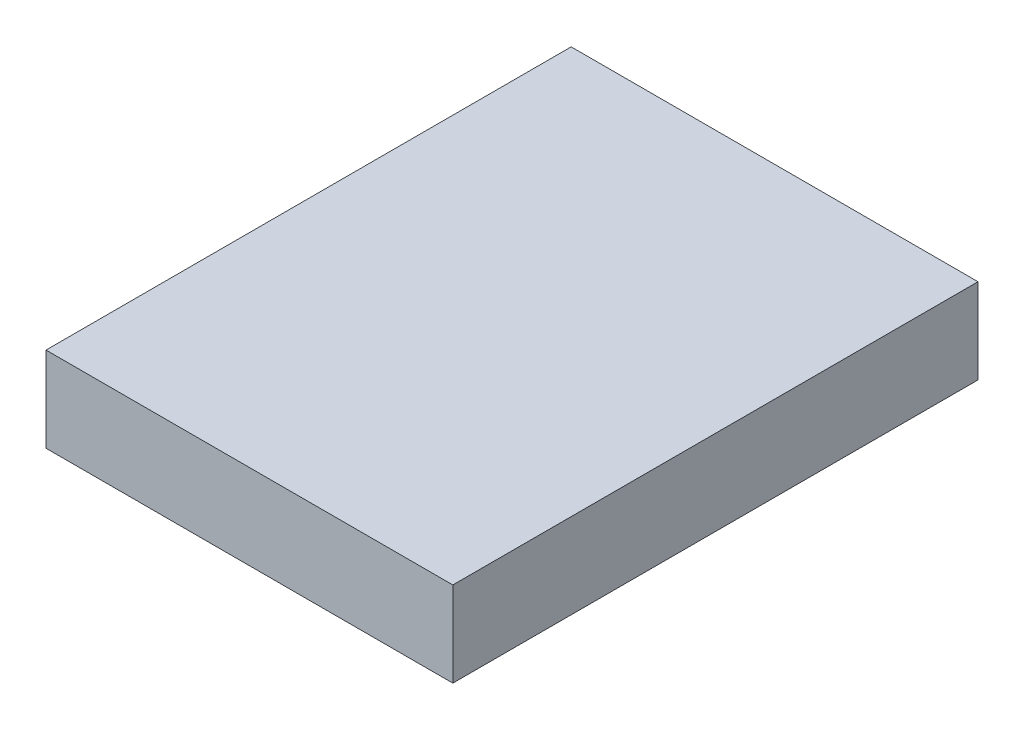
ISO-10303-21;
HEADER;
FILE_DESCRIPTION(('STEP AP214'),'2;1');
FILE_NAME('part.step','',(''),(''),'','','');
FILE_SCHEMA(('AUTOMOTIVE_DESIGN { 1 0 10303 214 1 1 1 1 }'));
ENDSEC;
DATA;
#1=APPLICATION_CONTEXT('core data for automotive mechanical design processes');
#2=APPLICATION_PROTOCOL_DEFINITION('international standard','automotive_design',2000,#1);
#3=PRODUCT_CONTEXT('',#1,'mechanical');
#4=PRODUCT('Part','Part','',(#3));
#5=PRODUCT_RELATED_PRODUCT_CATEGORY('part','',(#4));
#6=PRODUCT_DEFINITION_FORMATION('','',#4);
#7=PRODUCT_DEFINITION_CONTEXT('part definition',#1,'design');
#8=PRODUCT_DEFINITION('design','',#6,#7);
#9=PRODUCT_DEFINITION_SHAPE('','',#8);
#10=(LENGTH_UNIT() NAMED_UNIT(*) SI_UNIT(.MILLI.,.METRE.));
#11=(NAMED_UNIT(*) PLANE_ANGLE_UNIT() SI_UNIT($,.RADIAN.));
#12=(NAMED_UNIT(*) SI_UNIT($,.STERADIAN.) SOLID_ANGLE_UNIT());
#13=UNCERTAINTY_MEASURE_WITH_UNIT(LENGTH_MEASURE(1.E-05),#10,'distance_accuracy_value','');
#14=(GEOMETRIC_REPRESENTATION_CONTEXT(3) GLOBAL_UNCERTAINTY_ASSIGNED_CONTEXT((#13)) GLOBAL_UNIT_ASSIGNED_CONTEXT((#10,
#11,#12)) REPRESENTATION_CONTEXT('',''));
#15=CARTESIAN_POINT('',(0.,0.,0.));
#16=DIRECTION('',(0.,0.,1.));
#17=DIRECTION('',(1.,0.,0.));
#18=AXIS2_PLACEMENT_3D('',#15,#16,#17);
#19=CARTESIAN_POINT('',(55.,11.5,0.));
#20=DIRECTION('',(0.,0.,-1.));
#21=DIRECTION('',(-1.,0.,0.));
#22=AXIS2_PLACEMENT_3D('',#19,#20,#21);
#23=PLANE('',#22);
#24=DIRECTION('',(1.,0.,0.));
#25=VECTOR('',#24,1.);
#26=CARTESIAN_POINT('',(55.,0.,0.));
#27=LINE('',#26,#25);
#28=CARTESIAN_POINT('',(0.,0.,0.));
#29=VERTEX_POINT('',#28);
#30=CARTESIAN_POINT('',(55.,0.,0.));
#31=VERTEX_POINT('',#30);
#32=EDGE_CURVE('E97',#29,#31,#27,.T.);
#33=ORIENTED_EDGE('',*,*,#32,.T.);
#34=DIRECTION('',(0.,-1.,0.));
#35=VECTOR('',#34,1.);
#36=CARTESIAN_POINT('',(55.,11.5,0.));
#37=LINE('',#36,#35);
#38=CARTESIAN_POINT('',(55.,11.5,0.));
#39=VERTEX_POINT('',#38);
#40=EDGE_CURVE('E11',#39,#31,#37,.T.);
#41=ORIENTED_EDGE('',*,*,#40,.F.);
#42=DIRECTION('',(1.,0.,0.));
#43=VECTOR('',#42,1.);
#44=CARTESIAN_POINT('',(55.,11.5,0.));
#45=LINE('',#44,#43);
#46=CARTESIAN_POINT('',(0.,11.5,0.));
#47=VERTEX_POINT('',#46);
#48=EDGE_CURVE('E85',#47,#39,#45,.T.);
#49=ORIENTED_EDGE('',*,*,#48,.F.);
#50=DIRECTION('',(0.,-1.,0.));
#51=VECTOR('',#50,1.);
#52=CARTESIAN_POINT('',(0.,11.5,0.));
#53=LINE('',#52,#51);
#54=EDGE_CURVE('E93',#47,#29,#53,.T.);
#55=ORIENTED_EDGE('',*,*,#54,.T.);
#56=EDGE_LOOP('',(#33,#41,#49,#55));
#57=FACE_BOUND('',#56,.T.);
#58=ADVANCED_FACE('F34',(#57),#23,.F.);
#59=CARTESIAN_POINT('',(55.,11.5,-71.));
#60=DIRECTION('',(-1.,0.,0.));
#61=DIRECTION('',(0.,0.,1.));
#62=AXIS2_PLACEMENT_3D('',#59,#60,#61);
#63=PLANE('',#62);
#64=DIRECTION('',(0.,0.,-1.));
#65=VECTOR('',#64,1.);
#66=CARTESIAN_POINT('',(55.,0.,-71.));
#67=LINE('',#66,#65);
#68=CARTESIAN_POINT('',(55.,0.,-71.));
#69=VERTEX_POINT('',#68);
#70=EDGE_CURVE('E89',#31,#69,#67,.T.);
#71=ORIENTED_EDGE('',*,*,#70,.T.);
#72=DIRECTION('',(0.,-1.,0.));
#73=VECTOR('',#72,1.);
#74=CARTESIAN_POINT('',(55.,11.5,-71.));
#75=LINE('',#74,#73);
#76=CARTESIAN_POINT('',(55.,11.5,-71.));
#77=VERTEX_POINT('',#76);
#78=EDGE_CURVE('E42',#77,#69,#75,.T.);
#79=ORIENTED_EDGE('',*,*,#78,.F.);
#80=DIRECTION('',(0.,0.,-1.));
#81=VECTOR('',#80,1.);
#82=CARTESIAN_POINT('',(55.,11.5,-71.));
#83=LINE('',#82,#81);
#84=EDGE_CURVE('E80',#39,#77,#83,.T.);
#85=ORIENTED_EDGE('',*,*,#84,.F.);
#86=ORIENTED_EDGE('',*,*,#40,.T.);
#87=EDGE_LOOP('',(#71,#79,#85,#86));
#88=FACE_BOUND('',#87,.T.);
#89=ADVANCED_FACE('F88',(#88),#63,.F.);
#90=CARTESIAN_POINT('',(0.,11.5,-71.));
#91=DIRECTION('',(0.,0.,1.));
#92=DIRECTION('',(1.,0.,0.));
#93=AXIS2_PLACEMENT_3D('',#90,#91,#92);
#94=PLANE('',#93);
#95=DIRECTION('',(-1.,0.,0.));
#96=VECTOR('',#95,1.);
#97=CARTESIAN_POINT('',(0.,0.,-71.));
#98=LINE('',#97,#96);
#99=CARTESIAN_POINT('',(0.,0.,-71.));
#100=VERTEX_POINT('',#99);
#101=EDGE_CURVE('E67',#69,#100,#98,.T.);
#102=ORIENTED_EDGE('',*,*,#101,.T.);
#103=DIRECTION('',(0.,-1.,0.));
#104=VECTOR('',#103,1.);
#105=CARTESIAN_POINT('',(0.,11.5,-71.));
#106=LINE('',#105,#104);
#107=CARTESIAN_POINT('',(0.,11.5,-71.));
#108=VERTEX_POINT('',#107);
#109=EDGE_CURVE('E90',#108,#100,#106,.T.);
#110=ORIENTED_EDGE('',*,*,#109,.F.);
#111=DIRECTION('',(-1.,0.,0.));
#112=VECTOR('',#111,1.);
#113=CARTESIAN_POINT('',(0.,11.5,-71.));
#114=LINE('',#113,#112);
#115=EDGE_CURVE('E83',#77,#108,#114,.T.);
#116=ORIENTED_EDGE('',*,*,#115,.F.);
#117=ORIENTED_EDGE('',*,*,#78,.T.);
#118=EDGE_LOOP('',(#102,#110,#116,#117));
#119=FACE_BOUND('',#118,.T.);
#120=ADVANCED_FACE('F91',(#119),#94,.F.);
#121=CARTESIAN_POINT('',(0.,11.5,0.));
#122=DIRECTION('',(1.,0.,0.));
#123=DIRECTION('',(0.,0.,-1.));
#124=AXIS2_PLACEMENT_3D('',#121,#122,#123);
#125=PLANE('',#124);
#126=DIRECTION('',(0.,0.,1.));
#127=VECTOR('',#126,1.);
#128=CARTESIAN_POINT('',(0.,0.,0.));
#129=LINE('',#128,#127);
#130=EDGE_CURVE('E73',#100,#29,#129,.T.);
#131=ORIENTED_EDGE('',*,*,#130,.T.);
#132=ORIENTED_EDGE('',*,*,#54,.F.);
#133=DIRECTION('',(0.,0.,1.));
#134=VECTOR('',#133,1.);
#135=CARTESIAN_POINT('',(0.,11.5,0.));
#136=LINE('',#135,#134);
#137=EDGE_CURVE('E50',#108,#47,#136,.T.);
#138=ORIENTED_EDGE('',*,*,#137,.F.);
#139=ORIENTED_EDGE('',*,*,#109,.T.);
#140=EDGE_LOOP('',(#131,#132,#138,#139));
#141=FACE_BOUND('',#140,.T.);
#142=ADVANCED_FACE('F104',(#141),#125,.F.);
#143=CARTESIAN_POINT('',(0.,11.5,0.));
#144=DIRECTION('',(0.,-1.,0.));
#145=DIRECTION('',(0.,0.,-1.));
#146=AXIS2_PLACEMENT_3D('',#143,#144,#145);
#147=PLANE('',#146);
#148=ORIENTED_EDGE('',*,*,#48,.T.);
#149=ORIENTED_EDGE('',*,*,#84,.T.);
#150=ORIENTED_EDGE('',*,*,#115,.T.);
#151=ORIENTED_EDGE('',*,*,#137,.T.);
#152=EDGE_LOOP('',(#148,#149,#150,#151));
#153=FACE_BOUND('',#152,.T.);
#154=ADVANCED_FACE('F81',(#153),#147,.F.);
#155=CARTESIAN_POINT('',(0.,0.,0.));
#156=DIRECTION('',(0.,-1.,0.));
#157=DIRECTION('',(0.,0.,-1.));
#158=AXIS2_PLACEMENT_3D('',#155,#156,#157);
#159=PLANE('',#158);
#160=ORIENTED_EDGE('',*,*,#32,.F.);
#161=ORIENTED_EDGE('',*,*,#130,.F.);
#162=ORIENTED_EDGE('',*,*,#101,.F.);
#163=ORIENTED_EDGE('',*,*,#70,.F.);
#164=EDGE_LOOP('',(#160,#161,#162,#163));
#165=FACE_BOUND('',#164,.T.);
#166=ADVANCED_FACE('F107',(#165),#159,.T.);
#167=CLOSED_SHELL('',(#58,#89,#120,#142,#154,#166));
#168=MANIFOLD_SOLID_BREP('B2',#167);
#169=ADVANCED_BREP_SHAPE_REPRESENTATION('',(#18,#168),#14);
#170=SHAPE_DEFINITION_REPRESENTATION(#9,#169);
ENDSEC;
END-ISO-10303-21;
